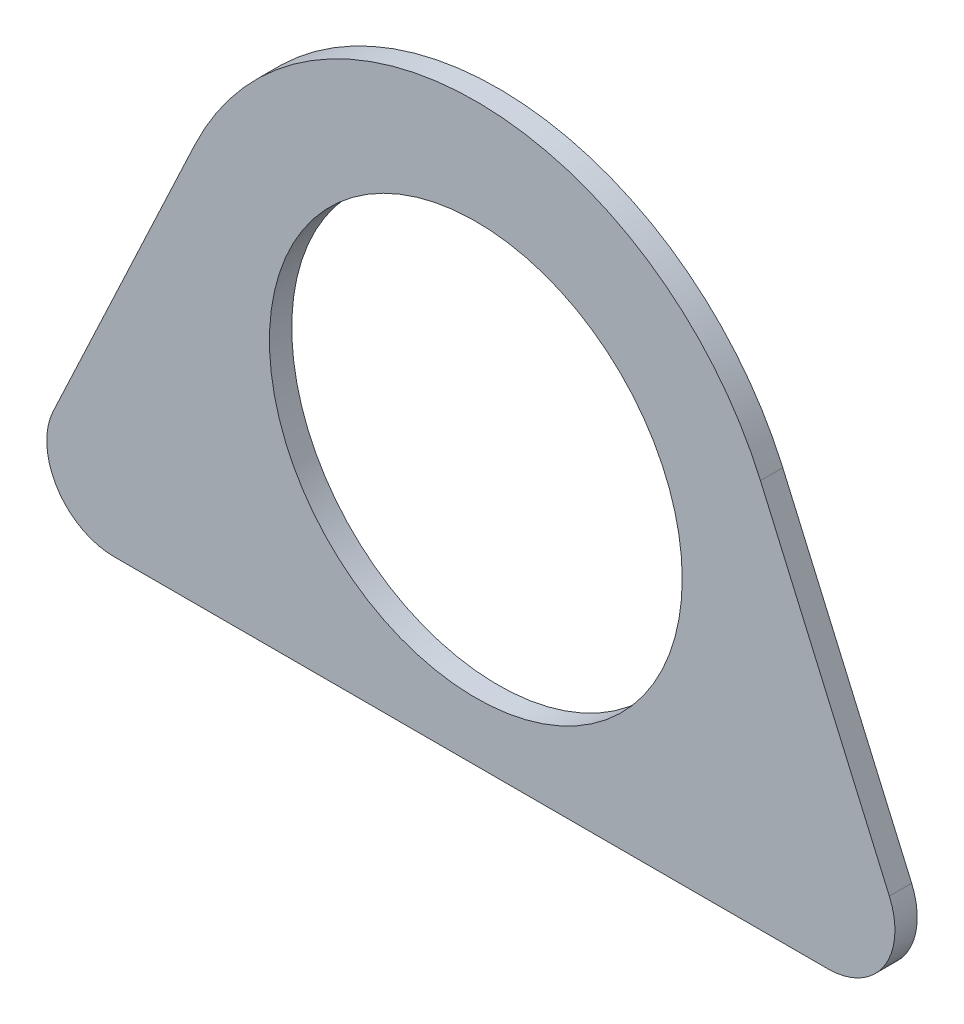
ISO-10303-21;
HEADER;
FILE_DESCRIPTION(('STEP AP214'),'2;1');
FILE_NAME('part.step','',(''),(''),'','','');
FILE_SCHEMA(('AUTOMOTIVE_DESIGN { 1 0 10303 214 1 1 1 1 }'));
ENDSEC;
DATA;
#1=APPLICATION_CONTEXT('core data for automotive mechanical design processes');
#2=APPLICATION_PROTOCOL_DEFINITION('international standard','automotive_design',2000,#1);
#3=PRODUCT_CONTEXT('',#1,'mechanical');
#4=PRODUCT('Part','Part','',(#3));
#5=PRODUCT_RELATED_PRODUCT_CATEGORY('part','',(#4));
#6=PRODUCT_DEFINITION_FORMATION('','',#4);
#7=PRODUCT_DEFINITION_CONTEXT('part definition',#1,'design');
#8=PRODUCT_DEFINITION('design','',#6,#7);
#9=PRODUCT_DEFINITION_SHAPE('','',#8);
#10=(LENGTH_UNIT() NAMED_UNIT(*) SI_UNIT(.MILLI.,.METRE.));
#11=(NAMED_UNIT(*) PLANE_ANGLE_UNIT() SI_UNIT($,.RADIAN.));
#12=(NAMED_UNIT(*) SI_UNIT($,.STERADIAN.) SOLID_ANGLE_UNIT());
#13=UNCERTAINTY_MEASURE_WITH_UNIT(LENGTH_MEASURE(1.E-05),#10,'distance_accuracy_value','');
#14=(GEOMETRIC_REPRESENTATION_CONTEXT(3) GLOBAL_UNCERTAINTY_ASSIGNED_CONTEXT((#13)) GLOBAL_UNIT_ASSIGNED_CONTEXT((#10,
#11,#12)) REPRESENTATION_CONTEXT('',''));
#15=CARTESIAN_POINT('',(0.,0.,0.));
#16=DIRECTION('',(0.,0.,1.));
#17=DIRECTION('',(1.,0.,0.));
#18=AXIS2_PLACEMENT_3D('',#15,#16,#17);
#19=CARTESIAN_POINT('',(-46.1854989092842,79.,165.));
#20=DIRECTION('',(0.,0.,-1.));
#21=DIRECTION('',(-1.,0.,0.));
#22=AXIS2_PLACEMENT_3D('',#19,#20,#21);
#23=PLANE('',#22);
#24=DIRECTION('',(1.,0.,0.));
#25=VECTOR('',#24,1.);
#26=CARTESIAN_POINT('',(-45.3050219668401,70.,165.));
#27=LINE('',#26,#25);
#28=CARTESIAN_POINT('',(-46.1854989092842,70.,165.));
#29=VERTEX_POINT('',#28);
#30=CARTESIAN_POINT('',(49.8469308483144,70.,165.));
#31=VERTEX_POINT('',#30);
#32=EDGE_CURVE('E86',#29,#31,#27,.T.);
#33=ORIENTED_EDGE('',*,*,#32,.T.);
#34=CARTESIAN_POINT('',(49.8469308483144,79.,165.));
#35=DIRECTION('',(0.,0.,1.));
#36=DIRECTION('',(1.,0.,0.));
#37=AXIS2_PLACEMENT_3D('',#34,#35,#36);
#38=CIRCLE('',#37,8.99999999999999);
#39=CARTESIAN_POINT('',(58.0958844998692,82.5992726563154,165.));
#40=VERTEX_POINT('',#39);
#41=EDGE_CURVE('E143',#31,#40,#38,.T.);
#42=ORIENTED_EDGE('',*,*,#41,.T.);
#43=DIRECTION('',(-0.399919184035049,0.916550405728316,0.));
#44=VECTOR('',#43,1.);
#45=CARTESIAN_POINT('',(58.0958844998692,82.5992726563154,165.));
#46=LINE('',#45,#44);
#47=CARTESIAN_POINT('',(40.7659794391572,122.316625933463,165.));
#48=VERTEX_POINT('',#47);
#49=EDGE_CURVE('E100',#40,#48,#46,.T.);
#50=ORIENTED_EDGE('',*,*,#49,.T.);
#51=CARTESIAN_POINT('',(2.50000000000002,105.62,165.));
#52=DIRECTION('',(0.,0.,1.));
#53=DIRECTION('',(1.,0.,0.));
#54=AXIS2_PLACEMENT_3D('',#51,#52,#53);
#55=CIRCLE('',#54,41.75);
#56=CARTESIAN_POINT('',(-35.2893302198368,123.369056919626,165.));
#57=VERTEX_POINT('',#56);
#58=EDGE_CURVE('E94',#48,#57,#55,.T.);
#59=ORIENTED_EDGE('',*,*,#58,.T.);
#60=DIRECTION('',(-0.425127111847331,-0.905133657960164,0.));
#61=VECTOR('',#60,1.);
#62=CARTESIAN_POINT('',(-35.2893302198368,123.369056919626,165.));
#63=LINE('',#62,#61);
#64=CARTESIAN_POINT('',(-54.3317018309257,82.826144006626,165.));
#65=VERTEX_POINT('',#64);
#66=EDGE_CURVE('E98',#57,#65,#63,.T.);
#67=ORIENTED_EDGE('',*,*,#66,.T.);
#68=CARTESIAN_POINT('',(-46.1854989092842,79.,165.));
#69=DIRECTION('',(0.,0.,1.));
#70=DIRECTION('',(-1.,0.,0.));
#71=AXIS2_PLACEMENT_3D('',#68,#69,#70);
#72=CIRCLE('',#71,9.);
#73=EDGE_CURVE('E50',#65,#29,#72,.T.);
#74=ORIENTED_EDGE('',*,*,#73,.T.);
#75=EDGE_LOOP('',(#33,#42,#50,#59,#67,#74));
#76=FACE_BOUND('',#75,.T.);
#77=CARTESIAN_POINT('',(2.50000000000054,105.61875,165.));
#78=DIRECTION('',(0.,0.,1.));
#79=DIRECTION('',(1.,0.,0.));
#80=AXIS2_PLACEMENT_3D('',#77,#78,#79);
#81=CIRCLE('',#80,27.75);
#82=CARTESIAN_POINT('',(30.2500000000005,105.61875,165.));
#83=VERTEX_POINT('',#82);
#84=EDGE_CURVE('E120',#83,#83,#81,.T.);
#85=ORIENTED_EDGE('',*,*,#84,.F.);
#86=EDGE_LOOP('',(#85));
#87=FACE_BOUND('',#86,.T.);
#88=ADVANCED_FACE('F33',(#76,#87),#23,.F.);
#89=CARTESIAN_POINT('',(-46.1854989092842,79.,162.));
#90=DIRECTION('',(0.,0.,-1.));
#91=DIRECTION('',(-1.,0.,0.));
#92=AXIS2_PLACEMENT_3D('',#89,#90,#91);
#93=PLANE('',#92);
#94=DIRECTION('',(1.,0.,0.));
#95=VECTOR('',#94,1.);
#96=CARTESIAN_POINT('',(45.3050219668401,70.,162.));
#97=LINE('',#96,#95);
#98=CARTESIAN_POINT('',(-46.1854989092842,70.,162.));
#99=VERTEX_POINT('',#98);
#100=CARTESIAN_POINT('',(49.8469308483144,70.,162.));
#101=VERTEX_POINT('',#100);
#102=EDGE_CURVE('E80',#99,#101,#97,.T.);
#103=ORIENTED_EDGE('',*,*,#102,.F.);
#104=CARTESIAN_POINT('',(-46.1854989092842,79.,162.));
#105=DIRECTION('',(0.,0.,1.));
#106=DIRECTION('',(-1.,0.,0.));
#107=AXIS2_PLACEMENT_3D('',#104,#105,#106);
#108=CIRCLE('',#107,9.);
#109=CARTESIAN_POINT('',(-54.3317018309257,82.826144006626,162.));
#110=VERTEX_POINT('',#109);
#111=EDGE_CURVE('E126',#110,#99,#108,.T.);
#112=ORIENTED_EDGE('',*,*,#111,.F.);
#113=DIRECTION('',(-0.425127111847331,-0.905133657960164,0.));
#114=VECTOR('',#113,1.);
#115=CARTESIAN_POINT('',(-35.2893302198368,123.369056919626,162.));
#116=LINE('',#115,#114);
#117=CARTESIAN_POINT('',(-35.2893302198368,123.369056919626,162.));
#118=VERTEX_POINT('',#117);
#119=EDGE_CURVE('E73',#118,#110,#116,.T.);
#120=ORIENTED_EDGE('',*,*,#119,.F.);
#121=CARTESIAN_POINT('',(2.50000000000002,105.62,162.));
#122=DIRECTION('',(0.,0.,1.));
#123=DIRECTION('',(1.,0.,0.));
#124=AXIS2_PLACEMENT_3D('',#121,#122,#123);
#125=CIRCLE('',#124,41.75);
#126=CARTESIAN_POINT('',(40.7659794391572,122.316625933463,162.));
#127=VERTEX_POINT('',#126);
#128=EDGE_CURVE('E108',#127,#118,#125,.T.);
#129=ORIENTED_EDGE('',*,*,#128,.F.);
#130=DIRECTION('',(-0.399919184035049,0.916550405728316,0.));
#131=VECTOR('',#130,1.);
#132=CARTESIAN_POINT('',(58.0958844998692,82.5992726563154,162.));
#133=LINE('',#132,#131);
#134=CARTESIAN_POINT('',(58.0958844998692,82.5992726563154,162.));
#135=VERTEX_POINT('',#134);
#136=EDGE_CURVE('E122',#135,#127,#133,.T.);
#137=ORIENTED_EDGE('',*,*,#136,.F.);
#138=CARTESIAN_POINT('',(49.8469308483144,79.,162.));
#139=DIRECTION('',(0.,0.,1.));
#140=DIRECTION('',(1.,0.,0.));
#141=AXIS2_PLACEMENT_3D('',#138,#139,#140);
#142=CIRCLE('',#141,8.99999999999999);
#143=EDGE_CURVE('E119',#101,#135,#142,.T.);
#144=ORIENTED_EDGE('',*,*,#143,.F.);
#145=EDGE_LOOP('',(#103,#112,#120,#129,#137,#144));
#146=FACE_BOUND('',#145,.T.);
#147=CARTESIAN_POINT('',(2.50000000000054,105.61875,162.));
#148=DIRECTION('',(0.,0.,1.));
#149=DIRECTION('',(1.,0.,0.));
#150=AXIS2_PLACEMENT_3D('',#147,#148,#149);
#151=CIRCLE('',#150,27.75);
#152=CARTESIAN_POINT('',(30.2500000000005,105.61875,162.));
#153=VERTEX_POINT('',#152);
#154=EDGE_CURVE('E147',#153,#153,#151,.T.);
#155=ORIENTED_EDGE('',*,*,#154,.T.);
#156=EDGE_LOOP('',(#155));
#157=FACE_BOUND('',#156,.T.);
#158=ADVANCED_FACE('F138',(#146,#157),#93,.T.);
#159=CARTESIAN_POINT('',(45.3050219668401,70.,165.));
#160=DIRECTION('',(0.,1.,0.));
#161=DIRECTION('',(-1.,0.,0.));
#162=AXIS2_PLACEMENT_3D('',#159,#160,#161);
#163=PLANE('',#162);
#164=ORIENTED_EDGE('',*,*,#102,.T.);
#165=DIRECTION('',(0.,0.,-1.));
#166=VECTOR('',#165,1.);
#167=CARTESIAN_POINT('',(49.8469308483144,70.,165.));
#168=LINE('',#167,#166);
#169=EDGE_CURVE('E11',#31,#101,#168,.T.);
#170=ORIENTED_EDGE('',*,*,#169,.F.);
#171=ORIENTED_EDGE('',*,*,#32,.F.);
#172=DIRECTION('',(0.,0.,-1.));
#173=VECTOR('',#172,1.);
#174=CARTESIAN_POINT('',(-46.1854989092842,70.,165.));
#175=LINE('',#174,#173);
#176=EDGE_CURVE('E114',#29,#99,#175,.T.);
#177=ORIENTED_EDGE('',*,*,#176,.T.);
#178=EDGE_LOOP('',(#164,#170,#171,#177));
#179=FACE_BOUND('',#178,.T.);
#180=ADVANCED_FACE('F35',(#179),#163,.F.);
#181=CARTESIAN_POINT('',(49.8469308483144,79.,165.));
#182=DIRECTION('',(0.,0.,-1.));
#183=DIRECTION('',(-1.,0.,0.));
#184=AXIS2_PLACEMENT_3D('',#181,#182,#183);
#185=CYLINDRICAL_SURFACE('',#184,8.99999999999999);
#186=ORIENTED_EDGE('',*,*,#143,.T.);
#187=DIRECTION('',(0.,0.,-1.));
#188=VECTOR('',#187,1.);
#189=CARTESIAN_POINT('',(58.0958844998692,82.5992726563154,165.));
#190=LINE('',#189,#188);
#191=EDGE_CURVE('E42',#40,#135,#190,.T.);
#192=ORIENTED_EDGE('',*,*,#191,.F.);
#193=ORIENTED_EDGE('',*,*,#41,.F.);
#194=ORIENTED_EDGE('',*,*,#169,.T.);
#195=EDGE_LOOP('',(#186,#192,#193,#194));
#196=FACE_BOUND('',#195,.T.);
#197=ADVANCED_FACE('F170',(#196),#185,.T.);
#198=CARTESIAN_POINT('',(58.0958844998692,82.5992726563154,165.));
#199=DIRECTION('',(-0.916550405728316,-0.399919184035049,0.));
#200=DIRECTION('',(0.399919184035049,-0.916550405728316,0.));
#201=AXIS2_PLACEMENT_3D('',#198,#199,#200);
#202=PLANE('',#201);
#203=ORIENTED_EDGE('',*,*,#136,.T.);
#204=DIRECTION('',(0.,0.,-1.));
#205=VECTOR('',#204,1.);
#206=CARTESIAN_POINT('',(40.7659794391572,122.316625933463,165.));
#207=LINE('',#206,#205);
#208=EDGE_CURVE('E109',#48,#127,#207,.T.);
#209=ORIENTED_EDGE('',*,*,#208,.F.);
#210=ORIENTED_EDGE('',*,*,#49,.F.);
#211=ORIENTED_EDGE('',*,*,#191,.T.);
#212=EDGE_LOOP('',(#203,#209,#210,#211));
#213=FACE_BOUND('',#212,.T.);
#214=ADVANCED_FACE('F135',(#213),#202,.F.);
#215=CARTESIAN_POINT('',(2.50000000000002,105.62,165.));
#216=DIRECTION('',(0.,0.,-1.));
#217=DIRECTION('',(-1.,0.,0.));
#218=AXIS2_PLACEMENT_3D('',#215,#216,#217);
#219=CYLINDRICAL_SURFACE('',#218,41.75);
#220=ORIENTED_EDGE('',*,*,#128,.T.);
#221=DIRECTION('',(0.,0.,-1.));
#222=VECTOR('',#221,1.);
#223=CARTESIAN_POINT('',(-35.2893302198368,123.369056919626,165.));
#224=LINE('',#223,#222);
#225=EDGE_CURVE('E105',#57,#118,#224,.T.);
#226=ORIENTED_EDGE('',*,*,#225,.F.);
#227=ORIENTED_EDGE('',*,*,#58,.F.);
#228=ORIENTED_EDGE('',*,*,#208,.T.);
#229=EDGE_LOOP('',(#220,#226,#227,#228));
#230=FACE_BOUND('',#229,.T.);
#231=ADVANCED_FACE('F106',(#230),#219,.T.);
#232=CARTESIAN_POINT('',(-35.2893302198368,123.369056919626,165.));
#233=DIRECTION('',(0.905133657960164,-0.425127111847331,0.));
#234=DIRECTION('',(0.425127111847331,0.905133657960164,0.));
#235=AXIS2_PLACEMENT_3D('',#232,#233,#234);
#236=PLANE('',#235);
#237=ORIENTED_EDGE('',*,*,#119,.T.);
#238=DIRECTION('',(0.,0.,-1.));
#239=VECTOR('',#238,1.);
#240=CARTESIAN_POINT('',(-54.3317018309257,82.826144006626,165.));
#241=LINE('',#240,#239);
#242=EDGE_CURVE('E110',#65,#110,#241,.T.);
#243=ORIENTED_EDGE('',*,*,#242,.F.);
#244=ORIENTED_EDGE('',*,*,#66,.F.);
#245=ORIENTED_EDGE('',*,*,#225,.T.);
#246=EDGE_LOOP('',(#237,#243,#244,#245));
#247=FACE_BOUND('',#246,.T.);
#248=ADVANCED_FACE('F112',(#247),#236,.F.);
#249=CARTESIAN_POINT('',(-46.1854989092842,79.,165.));
#250=DIRECTION('',(0.,0.,-1.));
#251=DIRECTION('',(-1.,0.,0.));
#252=AXIS2_PLACEMENT_3D('',#249,#250,#251);
#253=CYLINDRICAL_SURFACE('',#252,9.);
#254=ORIENTED_EDGE('',*,*,#111,.T.);
#255=ORIENTED_EDGE('',*,*,#176,.F.);
#256=ORIENTED_EDGE('',*,*,#73,.F.);
#257=ORIENTED_EDGE('',*,*,#242,.T.);
#258=EDGE_LOOP('',(#254,#255,#256,#257));
#259=FACE_BOUND('',#258,.T.);
#260=ADVANCED_FACE('F141',(#259),#253,.T.);
#261=CARTESIAN_POINT('',(2.50000000000054,105.61875,165.));
#262=DIRECTION('',(0.,0.,-1.));
#263=DIRECTION('',(-1.,0.,0.));
#264=AXIS2_PLACEMENT_3D('',#261,#262,#263);
#265=CYLINDRICAL_SURFACE('',#264,27.75);
#266=ORIENTED_EDGE('',*,*,#84,.T.);
#267=EDGE_LOOP('',(#266));
#268=FACE_BOUND('',#267,.T.);
#269=ORIENTED_EDGE('',*,*,#154,.F.);
#270=EDGE_LOOP('',(#269));
#271=FACE_BOUND('',#270,.T.);
#272=ADVANCED_FACE('F153',(#268,#271),#265,.F.);
#273=CLOSED_SHELL('',(#88,#158,#180,#197,#214,#231,#248,#260,#272));
#274=MANIFOLD_SOLID_BREP('B2',#273);
#275=ADVANCED_BREP_SHAPE_REPRESENTATION('',(#18,#274),#14);
#276=SHAPE_DEFINITION_REPRESENTATION(#9,#275);
ENDSEC;
END-ISO-10303-21;
